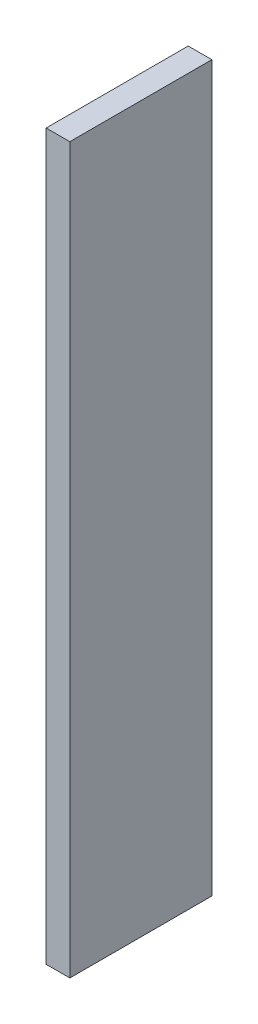
ISO-10303-21;
HEADER;
FILE_DESCRIPTION(('STEP AP214'),'2;1');
FILE_NAME('part.step','',(''),(''),'','','');
FILE_SCHEMA(('AUTOMOTIVE_DESIGN { 1 0 10303 214 1 1 1 1 }'));
ENDSEC;
DATA;
#1=APPLICATION_CONTEXT('core data for automotive mechanical design processes');
#2=APPLICATION_PROTOCOL_DEFINITION('international standard','automotive_design',2000,#1);
#3=PRODUCT_CONTEXT('',#1,'mechanical');
#4=PRODUCT('Part','Part','',(#3));
#5=PRODUCT_RELATED_PRODUCT_CATEGORY('part','',(#4));
#6=PRODUCT_DEFINITION_FORMATION('','',#4);
#7=PRODUCT_DEFINITION_CONTEXT('part definition',#1,'design');
#8=PRODUCT_DEFINITION('design','',#6,#7);
#9=PRODUCT_DEFINITION_SHAPE('','',#8);
#10=(LENGTH_UNIT() NAMED_UNIT(*) SI_UNIT(.MILLI.,.METRE.));
#11=(NAMED_UNIT(*) PLANE_ANGLE_UNIT() SI_UNIT($,.RADIAN.));
#12=(NAMED_UNIT(*) SI_UNIT($,.STERADIAN.) SOLID_ANGLE_UNIT());
#13=UNCERTAINTY_MEASURE_WITH_UNIT(LENGTH_MEASURE(1.E-05),#10,'distance_accuracy_value','');
#14=(GEOMETRIC_REPRESENTATION_CONTEXT(3) GLOBAL_UNCERTAINTY_ASSIGNED_CONTEXT((#13)) GLOBAL_UNIT_ASSIGNED_CONTEXT((#10,
#11,#12)) REPRESENTATION_CONTEXT('',''));
#15=CARTESIAN_POINT('',(0.,0.,0.));
#16=DIRECTION('',(0.,0.,1.));
#17=DIRECTION('',(1.,0.,0.));
#18=AXIS2_PLACEMENT_3D('',#15,#16,#17);
#19=CARTESIAN_POINT('',(0.,153.,0.));
#20=DIRECTION('',(1.,0.,0.));
#21=DIRECTION('',(0.,0.,-1.));
#22=AXIS2_PLACEMENT_3D('',#19,#20,#21);
#23=PLANE('',#22);
#24=DIRECTION('',(0.,0.,1.));
#25=VECTOR('',#24,1.);
#26=CARTESIAN_POINT('',(0.,0.,0.));
#27=LINE('',#26,#25);
#28=CARTESIAN_POINT('',(0.,0.,0.));
#29=VERTEX_POINT('',#28);
#30=CARTESIAN_POINT('',(0.,0.,30.));
#31=VERTEX_POINT('',#30);
#32=EDGE_CURVE('E98',#29,#31,#27,.T.);
#33=ORIENTED_EDGE('',*,*,#32,.T.);
#34=DIRECTION('',(0.,-1.,0.));
#35=VECTOR('',#34,1.);
#36=CARTESIAN_POINT('',(0.,153.,30.));
#37=LINE('',#36,#35);
#38=CARTESIAN_POINT('',(0.,153.,30.));
#39=VERTEX_POINT('',#38);
#40=EDGE_CURVE('E11',#39,#31,#37,.T.);
#41=ORIENTED_EDGE('',*,*,#40,.F.);
#42=DIRECTION('',(0.,0.,1.));
#43=VECTOR('',#42,1.);
#44=CARTESIAN_POINT('',(0.,153.,0.));
#45=LINE('',#44,#43);
#46=CARTESIAN_POINT('',(0.,153.,0.));
#47=VERTEX_POINT('',#46);
#48=EDGE_CURVE('E86',#47,#39,#45,.T.);
#49=ORIENTED_EDGE('',*,*,#48,.F.);
#50=DIRECTION('',(0.,-1.,0.));
#51=VECTOR('',#50,1.);
#52=CARTESIAN_POINT('',(0.,153.,0.));
#53=LINE('',#52,#51);
#54=EDGE_CURVE('E94',#47,#29,#53,.T.);
#55=ORIENTED_EDGE('',*,*,#54,.T.);
#56=EDGE_LOOP('',(#33,#41,#49,#55));
#57=FACE_BOUND('',#56,.T.);
#58=ADVANCED_FACE('F35',(#57),#23,.F.);
#59=CARTESIAN_POINT('',(0.,153.,30.));
#60=DIRECTION('',(0.,0.,-1.));
#61=DIRECTION('',(-1.,0.,0.));
#62=AXIS2_PLACEMENT_3D('',#59,#60,#61);
#63=PLANE('',#62);
#64=DIRECTION('',(1.,0.,0.));
#65=VECTOR('',#64,1.);
#66=CARTESIAN_POINT('',(0.,0.,30.));
#67=LINE('',#66,#65);
#68=CARTESIAN_POINT('',(5.,0.,30.));
#69=VERTEX_POINT('',#68);
#70=EDGE_CURVE('E90',#31,#69,#67,.T.);
#71=ORIENTED_EDGE('',*,*,#70,.T.);
#72=DIRECTION('',(0.,-1.,0.));
#73=VECTOR('',#72,1.);
#74=CARTESIAN_POINT('',(5.,153.,30.));
#75=LINE('',#74,#73);
#76=CARTESIAN_POINT('',(5.,153.,30.));
#77=VERTEX_POINT('',#76);
#78=EDGE_CURVE('E43',#77,#69,#75,.T.);
#79=ORIENTED_EDGE('',*,*,#78,.F.);
#80=DIRECTION('',(1.,0.,0.));
#81=VECTOR('',#80,1.);
#82=CARTESIAN_POINT('',(0.,153.,30.));
#83=LINE('',#82,#81);
#84=EDGE_CURVE('E81',#39,#77,#83,.T.);
#85=ORIENTED_EDGE('',*,*,#84,.F.);
#86=ORIENTED_EDGE('',*,*,#40,.T.);
#87=EDGE_LOOP('',(#71,#79,#85,#86));
#88=FACE_BOUND('',#87,.T.);
#89=ADVANCED_FACE('F89',(#88),#63,.F.);
#90=CARTESIAN_POINT('',(5.,153.,0.));
#91=DIRECTION('',(-1.,0.,0.));
#92=DIRECTION('',(0.,0.,1.));
#93=AXIS2_PLACEMENT_3D('',#90,#91,#92);
#94=PLANE('',#93);
#95=DIRECTION('',(0.,0.,-1.));
#96=VECTOR('',#95,1.);
#97=CARTESIAN_POINT('',(5.,0.,0.));
#98=LINE('',#97,#96);
#99=CARTESIAN_POINT('',(5.,0.,0.));
#100=VERTEX_POINT('',#99);
#101=EDGE_CURVE('E68',#69,#100,#98,.T.);
#102=ORIENTED_EDGE('',*,*,#101,.T.);
#103=DIRECTION('',(0.,-1.,0.));
#104=VECTOR('',#103,1.);
#105=CARTESIAN_POINT('',(5.,153.,0.));
#106=LINE('',#105,#104);
#107=CARTESIAN_POINT('',(5.,153.,0.));
#108=VERTEX_POINT('',#107);
#109=EDGE_CURVE('E91',#108,#100,#106,.T.);
#110=ORIENTED_EDGE('',*,*,#109,.F.);
#111=DIRECTION('',(0.,0.,-1.));
#112=VECTOR('',#111,1.);
#113=CARTESIAN_POINT('',(5.,153.,0.));
#114=LINE('',#113,#112);
#115=EDGE_CURVE('E84',#77,#108,#114,.T.);
#116=ORIENTED_EDGE('',*,*,#115,.F.);
#117=ORIENTED_EDGE('',*,*,#78,.T.);
#118=EDGE_LOOP('',(#102,#110,#116,#117));
#119=FACE_BOUND('',#118,.T.);
#120=ADVANCED_FACE('F92',(#119),#94,.F.);
#121=CARTESIAN_POINT('',(0.,153.,0.));
#122=DIRECTION('',(0.,0.,1.));
#123=DIRECTION('',(1.,0.,0.));
#124=AXIS2_PLACEMENT_3D('',#121,#122,#123);
#125=PLANE('',#124);
#126=DIRECTION('',(-1.,0.,0.));
#127=VECTOR('',#126,1.);
#128=CARTESIAN_POINT('',(0.,0.,0.));
#129=LINE('',#128,#127);
#130=EDGE_CURVE('E74',#100,#29,#129,.T.);
#131=ORIENTED_EDGE('',*,*,#130,.T.);
#132=ORIENTED_EDGE('',*,*,#54,.F.);
#133=DIRECTION('',(-1.,0.,0.));
#134=VECTOR('',#133,1.);
#135=CARTESIAN_POINT('',(0.,153.,0.));
#136=LINE('',#135,#134);
#137=EDGE_CURVE('E51',#108,#47,#136,.T.);
#138=ORIENTED_EDGE('',*,*,#137,.F.);
#139=ORIENTED_EDGE('',*,*,#109,.T.);
#140=EDGE_LOOP('',(#131,#132,#138,#139));
#141=FACE_BOUND('',#140,.T.);
#142=ADVANCED_FACE('F105',(#141),#125,.F.);
#143=CARTESIAN_POINT('',(0.,153.,0.));
#144=DIRECTION('',(0.,1.,0.));
#145=DIRECTION('',(0.,0.,1.));
#146=AXIS2_PLACEMENT_3D('',#143,#144,#145);
#147=PLANE('',#146);
#148=ORIENTED_EDGE('',*,*,#48,.T.);
#149=ORIENTED_EDGE('',*,*,#84,.T.);
#150=ORIENTED_EDGE('',*,*,#115,.T.);
#151=ORIENTED_EDGE('',*,*,#137,.T.);
#152=EDGE_LOOP('',(#148,#149,#150,#151));
#153=FACE_BOUND('',#152,.T.);
#154=ADVANCED_FACE('F82',(#153),#147,.T.);
#155=CARTESIAN_POINT('',(0.,0.,0.));
#156=DIRECTION('',(0.,1.,0.));
#157=DIRECTION('',(0.,0.,1.));
#158=AXIS2_PLACEMENT_3D('',#155,#156,#157);
#159=PLANE('',#158);
#160=ORIENTED_EDGE('',*,*,#32,.F.);
#161=ORIENTED_EDGE('',*,*,#130,.F.);
#162=ORIENTED_EDGE('',*,*,#101,.F.);
#163=ORIENTED_EDGE('',*,*,#70,.F.);
#164=EDGE_LOOP('',(#160,#161,#162,#163));
#165=FACE_BOUND('',#164,.T.);
#166=ADVANCED_FACE('F108',(#165),#159,.F.);
#167=CLOSED_SHELL('',(#58,#89,#120,#142,#154,#166));
#168=MANIFOLD_SOLID_BREP('B2',#167);
#169=ADVANCED_BREP_SHAPE_REPRESENTATION('',(#18,#168),#14);
#170=SHAPE_DEFINITION_REPRESENTATION(#9,#169);
ENDSEC;
END-ISO-10303-21;
